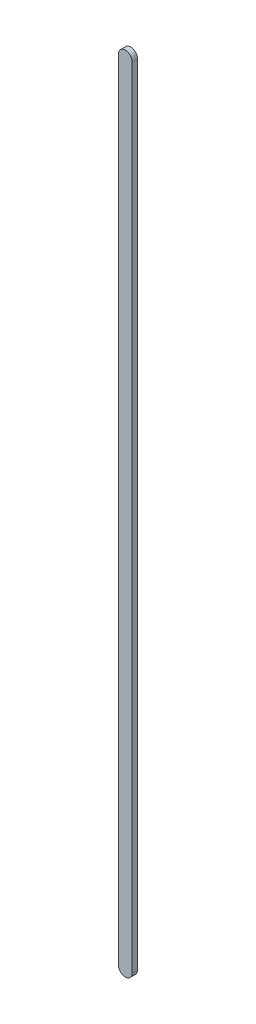
ISO-10303-21;
HEADER;
FILE_DESCRIPTION(('STEP AP214'),'2;1');
FILE_NAME('part.step','',(''),(''),'','','');
FILE_SCHEMA(('AUTOMOTIVE_DESIGN { 1 0 10303 214 1 1 1 1 }'));
ENDSEC;
DATA;
#1=APPLICATION_CONTEXT('core data for automotive mechanical design processes');
#2=APPLICATION_PROTOCOL_DEFINITION('international standard','automotive_design',2000,#1);
#3=PRODUCT_CONTEXT('',#1,'mechanical');
#4=PRODUCT('Part','Part','',(#3));
#5=PRODUCT_RELATED_PRODUCT_CATEGORY('part','',(#4));
#6=PRODUCT_DEFINITION_FORMATION('','',#4);
#7=PRODUCT_DEFINITION_CONTEXT('part definition',#1,'design');
#8=PRODUCT_DEFINITION('design','',#6,#7);
#9=PRODUCT_DEFINITION_SHAPE('','',#8);
#10=(LENGTH_UNIT() NAMED_UNIT(*) SI_UNIT(.MILLI.,.METRE.));
#11=(NAMED_UNIT(*) PLANE_ANGLE_UNIT() SI_UNIT($,.RADIAN.));
#12=(NAMED_UNIT(*) SI_UNIT($,.STERADIAN.) SOLID_ANGLE_UNIT());
#13=UNCERTAINTY_MEASURE_WITH_UNIT(LENGTH_MEASURE(1.E-05),#10,'distance_accuracy_value','');
#14=(GEOMETRIC_REPRESENTATION_CONTEXT(3) GLOBAL_UNCERTAINTY_ASSIGNED_CONTEXT((#13)) GLOBAL_UNIT_ASSIGNED_CONTEXT((#10,
#11,#12)) REPRESENTATION_CONTEXT('',''));
#15=CARTESIAN_POINT('',(0.,0.,0.));
#16=DIRECTION('',(0.,0.,1.));
#17=DIRECTION('',(1.,0.,0.));
#18=AXIS2_PLACEMENT_3D('',#15,#16,#17);
#19=CARTESIAN_POINT('',(150.622,73.6092,0.));
#20=DIRECTION('',(-1.,0.,0.));
#21=DIRECTION('',(0.,1.,0.));
#22=AXIS2_PLACEMENT_3D('',#19,#20,#21);
#23=PLANE('',#22);
#24=DIRECTION('',(0.,1.,0.));
#25=VECTOR('',#24,1.);
#26=CARTESIAN_POINT('',(150.622,73.6092,0.1999996));
#27=LINE('',#26,#25);
#28=CARTESIAN_POINT('',(150.622,73.6092,0.1999996));
#29=VERTEX_POINT('',#28);
#30=CARTESIAN_POINT('',(150.622,102.93163056,0.1999996));
#31=VERTEX_POINT('',#30);
#32=EDGE_CURVE('E11',#29,#31,#27,.T.);
#33=ORIENTED_EDGE('',*,*,#32,.F.);
#34=DIRECTION('',(0.,0.,1.));
#35=VECTOR('',#34,1.);
#36=CARTESIAN_POINT('',(150.622,73.6092,0.));
#37=LINE('',#36,#35);
#38=CARTESIAN_POINT('',(150.622,73.6092,0.));
#39=VERTEX_POINT('',#38);
#40=EDGE_CURVE('E24',#39,#29,#37,.T.);
#41=ORIENTED_EDGE('',*,*,#40,.F.);
#42=DIRECTION('',(0.,1.,0.));
#43=VECTOR('',#42,1.);
#44=CARTESIAN_POINT('',(150.622,73.6092,0.));
#45=LINE('',#44,#43);
#46=CARTESIAN_POINT('',(150.622,102.93163056,0.));
#47=VERTEX_POINT('',#46);
#48=EDGE_CURVE('E75',#39,#47,#45,.T.);
#49=ORIENTED_EDGE('',*,*,#48,.T.);
#50=DIRECTION('',(0.,0.,1.));
#51=VECTOR('',#50,1.);
#52=CARTESIAN_POINT('',(150.622,102.93163056,0.));
#53=LINE('',#52,#51);
#54=EDGE_CURVE('E37',#47,#31,#53,.T.);
#55=ORIENTED_EDGE('',*,*,#54,.T.);
#56=EDGE_LOOP('',(#33,#41,#49,#55));
#57=FACE_BOUND('',#56,.T.);
#58=ADVANCED_FACE('F17',(#57),#23,.F.);
#59=CARTESIAN_POINT('',(150.368,102.93163056,0.));
#60=DIRECTION('',(0.,0.,-1.));
#61=DIRECTION('',(1.,1.1189649382048E-13,0.));
#62=AXIS2_PLACEMENT_3D('',#59,#60,#61);
#63=CYLINDRICAL_SURFACE('',#62,0.25400000000001);
#64=CARTESIAN_POINT('',(150.368,102.93163056,0.1999996));
#65=DIRECTION('',(0.,0.,1.));
#66=DIRECTION('',(1.,1.1189649382048E-13,0.));
#67=AXIS2_PLACEMENT_3D('',#64,#65,#66);
#68=CIRCLE('',#67,0.25400000000001);
#69=CARTESIAN_POINT('',(150.114,102.93163056,0.1999996));
#70=VERTEX_POINT('',#69);
#71=EDGE_CURVE('E83',#31,#70,#68,.T.);
#72=ORIENTED_EDGE('',*,*,#71,.F.);
#73=ORIENTED_EDGE('',*,*,#54,.F.);
#74=CARTESIAN_POINT('',(150.368,102.93163056,0.));
#75=DIRECTION('',(0.,0.,1.));
#76=DIRECTION('',(1.,1.1189649382048E-13,0.));
#77=AXIS2_PLACEMENT_3D('',#74,#75,#76);
#78=CIRCLE('',#77,0.25400000000001);
#79=CARTESIAN_POINT('',(150.114,102.93163056,0.));
#80=VERTEX_POINT('',#79);
#81=EDGE_CURVE('E81',#47,#80,#78,.T.);
#82=ORIENTED_EDGE('',*,*,#81,.T.);
#83=DIRECTION('',(0.,0.,1.));
#84=VECTOR('',#83,1.);
#85=CARTESIAN_POINT('',(150.114,102.93163056,0.));
#86=LINE('',#85,#84);
#87=EDGE_CURVE('E67',#80,#70,#86,.T.);
#88=ORIENTED_EDGE('',*,*,#87,.T.);
#89=EDGE_LOOP('',(#72,#73,#82,#88));
#90=FACE_BOUND('',#89,.T.);
#91=ADVANCED_FACE('F89',(#90),#63,.T.);
#92=CARTESIAN_POINT('',(150.114,102.93163056,0.));
#93=DIRECTION('',(1.,0.,0.));
#94=DIRECTION('',(0.,-1.,0.));
#95=AXIS2_PLACEMENT_3D('',#92,#93,#94);
#96=PLANE('',#95);
#97=DIRECTION('',(0.,-1.,0.));
#98=VECTOR('',#97,1.);
#99=CARTESIAN_POINT('',(150.114,102.93163056,0.1999996));
#100=LINE('',#99,#98);
#101=CARTESIAN_POINT('',(150.114,73.6092,0.1999996));
#102=VERTEX_POINT('',#101);
#103=EDGE_CURVE('E71',#70,#102,#100,.T.);
#104=ORIENTED_EDGE('',*,*,#103,.F.);
#105=ORIENTED_EDGE('',*,*,#87,.F.);
#106=DIRECTION('',(0.,-1.,0.));
#107=VECTOR('',#106,1.);
#108=CARTESIAN_POINT('',(150.114,102.93163056,0.));
#109=LINE('',#108,#107);
#110=CARTESIAN_POINT('',(150.114,73.6092,0.));
#111=VERTEX_POINT('',#110);
#112=EDGE_CURVE('E63',#80,#111,#109,.T.);
#113=ORIENTED_EDGE('',*,*,#112,.T.);
#114=DIRECTION('',(0.,0.,1.));
#115=VECTOR('',#114,1.);
#116=CARTESIAN_POINT('',(150.114,73.6092,0.));
#117=LINE('',#116,#115);
#118=EDGE_CURVE('E53',#111,#102,#117,.T.);
#119=ORIENTED_EDGE('',*,*,#118,.T.);
#120=EDGE_LOOP('',(#104,#105,#113,#119));
#121=FACE_BOUND('',#120,.T.);
#122=ADVANCED_FACE('F66',(#121),#96,.F.);
#123=CARTESIAN_POINT('',(150.368,73.6092,0.));
#124=DIRECTION('',(0.,0.,-1.));
#125=DIRECTION('',(-1.,0.,0.));
#126=AXIS2_PLACEMENT_3D('',#123,#124,#125);
#127=CYLINDRICAL_SURFACE('',#126,0.25400000000001);
#128=CARTESIAN_POINT('',(150.368,73.6092,0.1999996));
#129=DIRECTION('',(0.,0.,1.));
#130=DIRECTION('',(-1.,0.,0.));
#131=AXIS2_PLACEMENT_3D('',#128,#129,#130);
#132=CIRCLE('',#131,0.25400000000001);
#133=EDGE_CURVE('E59',#102,#29,#132,.T.);
#134=ORIENTED_EDGE('',*,*,#133,.F.);
#135=ORIENTED_EDGE('',*,*,#118,.F.);
#136=CARTESIAN_POINT('',(150.368,73.6092,0.));
#137=DIRECTION('',(0.,0.,1.));
#138=DIRECTION('',(-1.,0.,0.));
#139=AXIS2_PLACEMENT_3D('',#136,#137,#138);
#140=CIRCLE('',#139,0.25400000000001);
#141=EDGE_CURVE('E57',#111,#39,#140,.T.);
#142=ORIENTED_EDGE('',*,*,#141,.T.);
#143=ORIENTED_EDGE('',*,*,#40,.T.);
#144=EDGE_LOOP('',(#134,#135,#142,#143));
#145=FACE_BOUND('',#144,.T.);
#146=ADVANCED_FACE('F55',(#145),#127,.T.);
#147=CARTESIAN_POINT('',(150.622,73.6092,0.));
#148=DIRECTION('',(0.,0.,-1.));
#149=DIRECTION('',(-1.,0.,0.));
#150=AXIS2_PLACEMENT_3D('',#147,#148,#149);
#151=PLANE('',#150);
#152=ORIENTED_EDGE('',*,*,#141,.F.);
#153=ORIENTED_EDGE('',*,*,#112,.F.);
#154=ORIENTED_EDGE('',*,*,#81,.F.);
#155=ORIENTED_EDGE('',*,*,#48,.F.);
#156=EDGE_LOOP('',(#152,#153,#154,#155));
#157=FACE_BOUND('',#156,.T.);
#158=ADVANCED_FACE('F74',(#157),#151,.T.);
#159=CARTESIAN_POINT('',(150.622,73.6092,0.1999996));
#160=DIRECTION('',(0.,0.,-1.));
#161=DIRECTION('',(-1.,0.,0.));
#162=AXIS2_PLACEMENT_3D('',#159,#160,#161);
#163=PLANE('',#162);
#164=ORIENTED_EDGE('',*,*,#32,.T.);
#165=ORIENTED_EDGE('',*,*,#71,.T.);
#166=ORIENTED_EDGE('',*,*,#103,.T.);
#167=ORIENTED_EDGE('',*,*,#133,.T.);
#168=EDGE_LOOP('',(#164,#165,#166,#167));
#169=FACE_BOUND('',#168,.T.);
#170=ADVANCED_FACE('F91',(#169),#163,.F.);
#171=CLOSED_SHELL('',(#58,#91,#122,#146,#158,#170));
#172=MANIFOLD_SOLID_BREP('B1',#171);
#173=ADVANCED_BREP_SHAPE_REPRESENTATION('',(#18,#172),#14);
#174=SHAPE_DEFINITION_REPRESENTATION(#9,#173);
ENDSEC;
END-ISO-10303-21;
